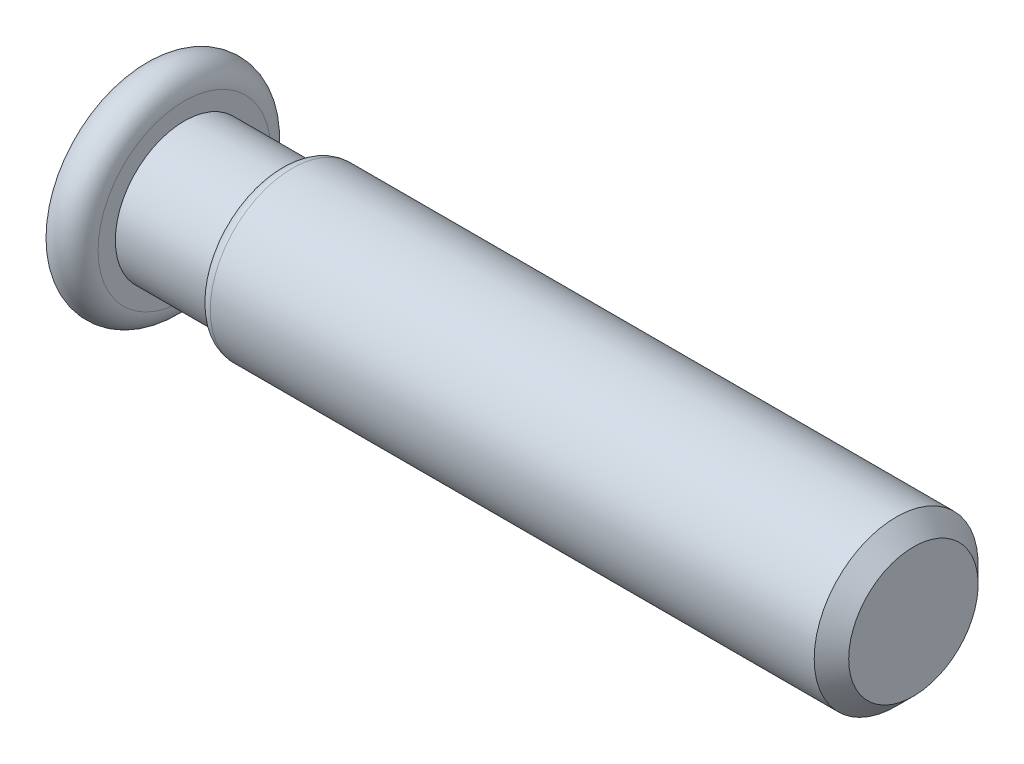
ISO-10303-21;
HEADER;
FILE_DESCRIPTION(('STEP AP214'),'2;1');
FILE_NAME('part.step','',(''),(''),'','','');
FILE_SCHEMA(('AUTOMOTIVE_DESIGN { 1 0 10303 214 1 1 1 1 }'));
ENDSEC;
DATA;
#1=APPLICATION_CONTEXT('core data for automotive mechanical design processes');
#2=APPLICATION_PROTOCOL_DEFINITION('international standard','automotive_design',2000,#1);
#3=PRODUCT_CONTEXT('',#1,'mechanical');
#4=PRODUCT('Part','Part','',(#3));
#5=PRODUCT_RELATED_PRODUCT_CATEGORY('part','',(#4));
#6=PRODUCT_DEFINITION_FORMATION('','',#4);
#7=PRODUCT_DEFINITION_CONTEXT('part definition',#1,'design');
#8=PRODUCT_DEFINITION('design','',#6,#7);
#9=PRODUCT_DEFINITION_SHAPE('','',#8);
#10=(LENGTH_UNIT() NAMED_UNIT(*) SI_UNIT(.MILLI.,.METRE.));
#11=(NAMED_UNIT(*) PLANE_ANGLE_UNIT() SI_UNIT($,.RADIAN.));
#12=(NAMED_UNIT(*) SI_UNIT($,.STERADIAN.) SOLID_ANGLE_UNIT());
#13=UNCERTAINTY_MEASURE_WITH_UNIT(LENGTH_MEASURE(1.E-05),#10,'distance_accuracy_value','');
#14=(GEOMETRIC_REPRESENTATION_CONTEXT(3) GLOBAL_UNCERTAINTY_ASSIGNED_CONTEXT((#13)) GLOBAL_UNIT_ASSIGNED_CONTEXT((#10,
#11,#12)) REPRESENTATION_CONTEXT('',''));
#15=CARTESIAN_POINT('',(0.,0.,0.));
#16=DIRECTION('',(0.,0.,1.));
#17=DIRECTION('',(1.,0.,0.));
#18=AXIS2_PLACEMENT_3D('',#15,#16,#17);
#19=CARTESIAN_POINT('',(0.,0.,0.));
#20=DIRECTION('',(1.,0.,0.));
#21=DIRECTION('',(0.,0.,-1.));
#22=AXIS2_PLACEMENT_3D('',#19,#20,#21);
#23=PLANE('',#22);
#24=CARTESIAN_POINT('',(0.,0.,0.));
#25=DIRECTION('',(-1.,0.,0.));
#26=DIRECTION('',(0.,0.,1.));
#27=AXIS2_PLACEMENT_3D('',#24,#25,#26);
#28=CIRCLE('',#27,10.);
#29=CARTESIAN_POINT('',(0.,0.,10.));
#30=VERTEX_POINT('',#29);
#31=EDGE_CURVE('E10',#30,#30,#28,.T.);
#32=ORIENTED_EDGE('',*,*,#31,.T.);
#33=EDGE_LOOP('',(#32));
#34=FACE_BOUND('',#33,.T.);
#35=ADVANCED_FACE('F35',(#34),#23,.F.);
#36=CARTESIAN_POINT('',(2.5,0.,0.));
#37=DIRECTION('',(-1.,0.,0.));
#38=DIRECTION('',(0.,0.,1.));
#39=AXIS2_PLACEMENT_3D('',#36,#37,#38);
#40=TOROIDAL_SURFACE('',#39,10.,2.5);
#41=ORIENTED_EDGE('',*,*,#31,.F.);
#42=EDGE_LOOP('',(#41));
#43=FACE_BOUND('',#42,.T.);
#44=CARTESIAN_POINT('',(5.,0.,0.));
#45=DIRECTION('',(-1.,0.,0.));
#46=DIRECTION('',(0.,0.,1.));
#47=AXIS2_PLACEMENT_3D('',#44,#45,#46);
#48=CIRCLE('',#47,10.);
#49=CARTESIAN_POINT('',(5.,0.,10.));
#50=VERTEX_POINT('',#49);
#51=EDGE_CURVE('E41',#50,#50,#48,.T.);
#52=ORIENTED_EDGE('',*,*,#51,.T.);
#53=EDGE_LOOP('',(#52));
#54=FACE_BOUND('',#53,.T.);
#55=ADVANCED_FACE('F76',(#43,#54),#40,.T.);
#56=CARTESIAN_POINT('',(5.,10.,0.));
#57=DIRECTION('',(-1.,0.,0.));
#58=DIRECTION('',(0.,0.,1.));
#59=AXIS2_PLACEMENT_3D('',#56,#57,#58);
#60=PLANE('',#59);
#61=ORIENTED_EDGE('',*,*,#51,.F.);
#62=EDGE_LOOP('',(#61));
#63=FACE_BOUND('',#62,.T.);
#64=CARTESIAN_POINT('',(5.,0.,0.));
#65=DIRECTION('',(-1.,0.,0.));
#66=DIRECTION('',(0.,0.,1.));
#67=AXIS2_PLACEMENT_3D('',#64,#65,#66);
#68=CIRCLE('',#67,8.);
#69=CARTESIAN_POINT('',(5.,0.,8.));
#70=VERTEX_POINT('',#69);
#71=EDGE_CURVE('E45',#70,#70,#68,.T.);
#72=ORIENTED_EDGE('',*,*,#71,.T.);
#73=EDGE_LOOP('',(#72));
#74=FACE_BOUND('',#73,.T.);
#75=ADVANCED_FACE('F80',(#63,#74),#60,.F.);
#76=CARTESIAN_POINT('',(0.,0.,0.));
#77=DIRECTION('',(-1.,0.,0.));
#78=DIRECTION('',(0.,0.,1.));
#79=AXIS2_PLACEMENT_3D('',#76,#77,#78);
#80=CYLINDRICAL_SURFACE('',#79,8.);
#81=ORIENTED_EDGE('',*,*,#71,.F.);
#82=EDGE_LOOP('',(#81));
#83=FACE_BOUND('',#82,.T.);
#84=CARTESIAN_POINT('',(16.,0.,0.));
#85=DIRECTION('',(-1.,0.,0.));
#86=DIRECTION('',(0.,0.,1.));
#87=AXIS2_PLACEMENT_3D('',#84,#85,#86);
#88=CIRCLE('',#87,8.);
#89=CARTESIAN_POINT('',(16.,0.,8.));
#90=VERTEX_POINT('',#89);
#91=EDGE_CURVE('E49',#90,#90,#88,.T.);
#92=ORIENTED_EDGE('',*,*,#91,.T.);
#93=EDGE_LOOP('',(#92));
#94=FACE_BOUND('',#93,.T.);
#95=ADVANCED_FACE('F85',(#83,#94),#80,.T.);
#96=CARTESIAN_POINT('',(17.5,0.,0.));
#97=DIRECTION('',(-1.,0.,0.));
#98=DIRECTION('',(0.,0.,1.));
#99=AXIS2_PLACEMENT_3D('',#96,#97,#98);
#100=TOROIDAL_SURFACE('',#99,8.,1.5);
#101=ORIENTED_EDGE('',*,*,#91,.F.);
#102=EDGE_LOOP('',(#101));
#103=FACE_BOUND('',#102,.T.);
#104=CARTESIAN_POINT('',(17.5,0.,0.));
#105=DIRECTION('',(-1.,0.,0.));
#106=DIRECTION('',(0.,0.,1.));
#107=AXIS2_PLACEMENT_3D('',#104,#105,#106);
#108=CIRCLE('',#107,9.5);
#109=CARTESIAN_POINT('',(17.5,0.,9.5));
#110=VERTEX_POINT('',#109);
#111=EDGE_CURVE('E54',#110,#110,#108,.T.);
#112=ORIENTED_EDGE('',*,*,#111,.T.);
#113=EDGE_LOOP('',(#112));
#114=FACE_BOUND('',#113,.T.);
#115=ADVANCED_FACE('F91',(#103,#114),#100,.T.);
#116=CARTESIAN_POINT('',(0.,0.,0.));
#117=DIRECTION('',(-1.,0.,0.));
#118=DIRECTION('',(0.,0.,1.));
#119=AXIS2_PLACEMENT_3D('',#116,#117,#118);
#120=CYLINDRICAL_SURFACE('',#119,9.5);
#121=ORIENTED_EDGE('',*,*,#111,.F.);
#122=EDGE_LOOP('',(#121));
#123=FACE_BOUND('',#122,.T.);
#124=CARTESIAN_POINT('',(87.5,0.,0.));
#125=DIRECTION('',(-1.,0.,0.));
#126=DIRECTION('',(0.,0.,1.));
#127=AXIS2_PLACEMENT_3D('',#124,#125,#126);
#128=CIRCLE('',#127,9.5);
#129=CARTESIAN_POINT('',(87.5,0.,9.5));
#130=VERTEX_POINT('',#129);
#131=EDGE_CURVE('E57',#130,#130,#128,.T.);
#132=ORIENTED_EDGE('',*,*,#131,.T.);
#133=EDGE_LOOP('',(#132));
#134=FACE_BOUND('',#133,.T.);
#135=ADVANCED_FACE('F72',(#123,#134),#120,.T.);
#136=CARTESIAN_POINT('',(89.5,0.,0.));
#137=DIRECTION('',(-1.,0.,0.));
#138=DIRECTION('',(0.,0.,1.));
#139=AXIS2_PLACEMENT_3D('',#136,#137,#138);
#140=CONICAL_SURFACE('',#139,7.49999999999999,0.78539816339745);
#141=ORIENTED_EDGE('',*,*,#131,.F.);
#142=EDGE_LOOP('',(#141));
#143=FACE_BOUND('',#142,.T.);
#144=CARTESIAN_POINT('',(89.5,0.,0.));
#145=DIRECTION('',(-1.,0.,0.));
#146=DIRECTION('',(0.,0.,1.));
#147=AXIS2_PLACEMENT_3D('',#144,#145,#146);
#148=CIRCLE('',#147,7.49999999999999);
#149=CARTESIAN_POINT('',(89.5,0.,7.49999999999999));
#150=VERTEX_POINT('',#149);
#151=EDGE_CURVE('E60',#150,#150,#148,.T.);
#152=ORIENTED_EDGE('',*,*,#151,.T.);
#153=EDGE_LOOP('',(#152));
#154=FACE_BOUND('',#153,.T.);
#155=ADVANCED_FACE('F64',(#143,#154),#140,.T.);
#156=CARTESIAN_POINT('',(89.5,7.49999999999999,0.));
#157=DIRECTION('',(-1.,0.,0.));
#158=DIRECTION('',(0.,0.,1.));
#159=AXIS2_PLACEMENT_3D('',#156,#157,#158);
#160=PLANE('',#159);
#161=ORIENTED_EDGE('',*,*,#151,.F.);
#162=EDGE_LOOP('',(#161));
#163=FACE_BOUND('',#162,.T.);
#164=ADVANCED_FACE('F66',(#163),#160,.F.);
#165=CLOSED_SHELL('',(#35,#55,#75,#95,#115,#135,#155,#164));
#166=MANIFOLD_SOLID_BREP('B2',#165);
#167=ADVANCED_BREP_SHAPE_REPRESENTATION('',(#18,#166),#14);
#168=SHAPE_DEFINITION_REPRESENTATION(#9,#167);
ENDSEC;
END-ISO-10303-21;
